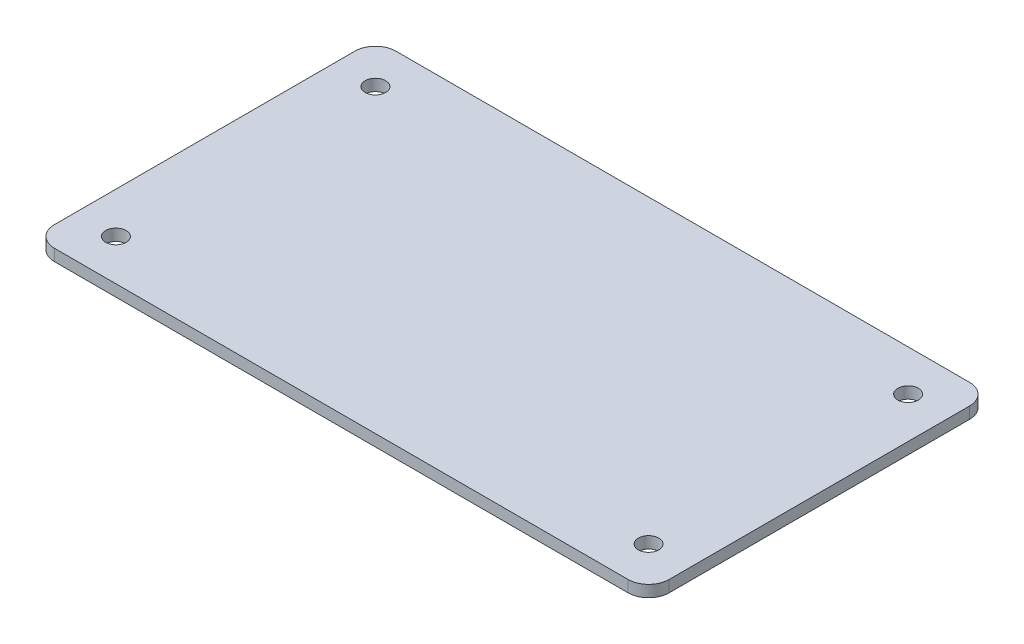
ISO-10303-21;
HEADER;
FILE_DESCRIPTION(('STEP AP214'),'2;1');
FILE_NAME('part.step','',(''),(''),'','','');
FILE_SCHEMA(('AUTOMOTIVE_DESIGN { 1 0 10303 214 1 1 1 1 }'));
ENDSEC;
DATA;
#1=APPLICATION_CONTEXT('core data for automotive mechanical design processes');
#2=APPLICATION_PROTOCOL_DEFINITION('international standard','automotive_design',2000,#1);
#3=PRODUCT_CONTEXT('',#1,'mechanical');
#4=PRODUCT('Part','Part','',(#3));
#5=PRODUCT_RELATED_PRODUCT_CATEGORY('part','',(#4));
#6=PRODUCT_DEFINITION_FORMATION('','',#4);
#7=PRODUCT_DEFINITION_CONTEXT('part definition',#1,'design');
#8=PRODUCT_DEFINITION('design','',#6,#7);
#9=PRODUCT_DEFINITION_SHAPE('','',#8);
#10=(LENGTH_UNIT() NAMED_UNIT(*) SI_UNIT(.MILLI.,.METRE.));
#11=(NAMED_UNIT(*) PLANE_ANGLE_UNIT() SI_UNIT($,.RADIAN.));
#12=(NAMED_UNIT(*) SI_UNIT($,.STERADIAN.) SOLID_ANGLE_UNIT());
#13=UNCERTAINTY_MEASURE_WITH_UNIT(LENGTH_MEASURE(1.E-05),#10,'distance_accuracy_value','');
#14=(GEOMETRIC_REPRESENTATION_CONTEXT(3) GLOBAL_UNCERTAINTY_ASSIGNED_CONTEXT((#13)) GLOBAL_UNIT_ASSIGNED_CONTEXT((#10,
#11,#12)) REPRESENTATION_CONTEXT('',''));
#15=CARTESIAN_POINT('',(0.,0.,0.));
#16=DIRECTION('',(0.,0.,1.));
#17=DIRECTION('',(1.,0.,0.));
#18=AXIS2_PLACEMENT_3D('',#15,#16,#17);
#19=CARTESIAN_POINT('',(-42.,1.7,22.));
#20=DIRECTION('',(0.,-1.,0.));
#21=DIRECTION('',(0.,0.,-1.));
#22=AXIS2_PLACEMENT_3D('',#19,#20,#21);
#23=PLANE('',#22);
#24=CARTESIAN_POINT('',(-42.,1.7,22.));
#25=DIRECTION('',(0.,1.,0.));
#26=DIRECTION('',(0.,0.,-1.));
#27=AXIS2_PLACEMENT_3D('',#24,#25,#26);
#28=CIRCLE('',#27,3.);
#29=CARTESIAN_POINT('',(-45.,1.7,22.));
#30=VERTEX_POINT('',#29);
#31=CARTESIAN_POINT('',(-42.,1.7,25.));
#32=VERTEX_POINT('',#31);
#33=EDGE_CURVE('E150',#30,#32,#28,.T.);
#34=ORIENTED_EDGE('',*,*,#33,.T.);
#35=DIRECTION('',(1.,0.,0.));
#36=VECTOR('',#35,1.);
#37=CARTESIAN_POINT('',(-42.,1.7,25.));
#38=LINE('',#37,#36);
#39=CARTESIAN_POINT('',(42.,1.7,25.));
#40=VERTEX_POINT('',#39);
#41=EDGE_CURVE('E98',#32,#40,#38,.T.);
#42=ORIENTED_EDGE('',*,*,#41,.T.);
#43=CARTESIAN_POINT('',(42.,1.7,22.));
#44=DIRECTION('',(0.,1.,0.));
#45=DIRECTION('',(0.,0.,-1.));
#46=AXIS2_PLACEMENT_3D('',#43,#44,#45);
#47=CIRCLE('',#46,3.);
#48=CARTESIAN_POINT('',(45.,1.7,22.));
#49=VERTEX_POINT('',#48);
#50=EDGE_CURVE('E165',#40,#49,#47,.T.);
#51=ORIENTED_EDGE('',*,*,#50,.T.);
#52=DIRECTION('',(0.,0.,-1.));
#53=VECTOR('',#52,1.);
#54=CARTESIAN_POINT('',(45.,1.7,22.));
#55=LINE('',#54,#53);
#56=CARTESIAN_POINT('',(45.,1.7,-22.));
#57=VERTEX_POINT('',#56);
#58=EDGE_CURVE('E178',#49,#57,#55,.T.);
#59=ORIENTED_EDGE('',*,*,#58,.T.);
#60=CARTESIAN_POINT('',(42.,1.7,-22.));
#61=DIRECTION('',(0.,1.,0.));
#62=DIRECTION('',(0.,0.,1.));
#63=AXIS2_PLACEMENT_3D('',#60,#61,#62);
#64=CIRCLE('',#63,3.);
#65=CARTESIAN_POINT('',(42.,1.7,-25.));
#66=VERTEX_POINT('',#65);
#67=EDGE_CURVE('E117',#57,#66,#64,.T.);
#68=ORIENTED_EDGE('',*,*,#67,.T.);
#69=DIRECTION('',(-1.,0.,0.));
#70=VECTOR('',#69,1.);
#71=CARTESIAN_POINT('',(-42.,1.7,-25.));
#72=LINE('',#71,#70);
#73=CARTESIAN_POINT('',(-42.,1.7,-25.));
#74=VERTEX_POINT('',#73);
#75=EDGE_CURVE('E111',#66,#74,#72,.T.);
#76=ORIENTED_EDGE('',*,*,#75,.T.);
#77=CARTESIAN_POINT('',(-42.,1.7,-22.));
#78=DIRECTION('',(0.,1.,0.));
#79=DIRECTION('',(0.,0.,-1.));
#80=AXIS2_PLACEMENT_3D('',#77,#78,#79);
#81=CIRCLE('',#80,3.);
#82=CARTESIAN_POINT('',(-45.,1.7,-22.));
#83=VERTEX_POINT('',#82);
#84=EDGE_CURVE('E115',#74,#83,#81,.T.);
#85=ORIENTED_EDGE('',*,*,#84,.T.);
#86=DIRECTION('',(0.,0.,1.));
#87=VECTOR('',#86,1.);
#88=CARTESIAN_POINT('',(-45.,1.7,22.));
#89=LINE('',#88,#87);
#90=EDGE_CURVE('E55',#83,#30,#89,.T.);
#91=ORIENTED_EDGE('',*,*,#90,.T.);
#92=EDGE_LOOP('',(#34,#42,#51,#59,#68,#76,#85,#91));
#93=FACE_BOUND('',#92,.T.);
#94=CARTESIAN_POINT('',(-39.,1.7,-19.));
#95=DIRECTION('',(0.,1.,0.));
#96=DIRECTION('',(0.,0.,1.));
#97=AXIS2_PLACEMENT_3D('',#94,#95,#96);
#98=CIRCLE('',#97,1.5);
#99=CARTESIAN_POINT('',(-39.,1.7,-17.5));
#100=VERTEX_POINT('',#99);
#101=EDGE_CURVE('E139',#100,#100,#98,.T.);
#102=ORIENTED_EDGE('',*,*,#101,.F.);
#103=EDGE_LOOP('',(#102));
#104=FACE_BOUND('',#103,.T.);
#105=CARTESIAN_POINT('',(39.,1.7,-19.));
#106=DIRECTION('',(0.,1.,0.));
#107=DIRECTION('',(0.,0.,1.));
#108=AXIS2_PLACEMENT_3D('',#105,#106,#107);
#109=CIRCLE('',#108,1.5);
#110=CARTESIAN_POINT('',(39.,1.7,-17.5));
#111=VERTEX_POINT('',#110);
#112=EDGE_CURVE('E187',#111,#111,#109,.T.);
#113=ORIENTED_EDGE('',*,*,#112,.F.);
#114=EDGE_LOOP('',(#113));
#115=FACE_BOUND('',#114,.T.);
#116=CARTESIAN_POINT('',(-39.,1.7,19.));
#117=DIRECTION('',(0.,1.,0.));
#118=DIRECTION('',(0.,0.,1.));
#119=AXIS2_PLACEMENT_3D('',#116,#117,#118);
#120=CIRCLE('',#119,1.5);
#121=CARTESIAN_POINT('',(-39.,1.7,20.5));
#122=VERTEX_POINT('',#121);
#123=EDGE_CURVE('E193',#122,#122,#120,.T.);
#124=ORIENTED_EDGE('',*,*,#123,.F.);
#125=EDGE_LOOP('',(#124));
#126=FACE_BOUND('',#125,.T.);
#127=CARTESIAN_POINT('',(39.,1.7,19.));
#128=DIRECTION('',(0.,1.,0.));
#129=DIRECTION('',(0.,0.,1.));
#130=AXIS2_PLACEMENT_3D('',#127,#128,#129);
#131=CIRCLE('',#130,1.5);
#132=CARTESIAN_POINT('',(39.,1.7,20.5));
#133=VERTEX_POINT('',#132);
#134=EDGE_CURVE('E199',#133,#133,#131,.T.);
#135=ORIENTED_EDGE('',*,*,#134,.F.);
#136=EDGE_LOOP('',(#135));
#137=FACE_BOUND('',#136,.T.);
#138=ADVANCED_FACE('F38',(#93,#104,#115,#126,#137),#23,.F.);
#139=CARTESIAN_POINT('',(-42.,0.,22.));
#140=DIRECTION('',(0.,-1.,0.));
#141=DIRECTION('',(0.,0.,-1.));
#142=AXIS2_PLACEMENT_3D('',#139,#140,#141);
#143=PLANE('',#142);
#144=CARTESIAN_POINT('',(-39.,0.,19.));
#145=DIRECTION('',(0.,1.,0.));
#146=DIRECTION('',(0.,0.,1.));
#147=AXIS2_PLACEMENT_3D('',#144,#145,#146);
#148=CIRCLE('',#147,1.5);
#149=CARTESIAN_POINT('',(-39.,0.,20.5));
#150=VERTEX_POINT('',#149);
#151=EDGE_CURVE('E196',#150,#150,#148,.T.);
#152=ORIENTED_EDGE('',*,*,#151,.T.);
#153=EDGE_LOOP('',(#152));
#154=FACE_BOUND('',#153,.T.);
#155=CARTESIAN_POINT('',(-39.,0.,-19.));
#156=DIRECTION('',(0.,1.,0.));
#157=DIRECTION('',(0.,0.,1.));
#158=AXIS2_PLACEMENT_3D('',#155,#156,#157);
#159=CIRCLE('',#158,1.5);
#160=CARTESIAN_POINT('',(-39.,0.,-17.5));
#161=VERTEX_POINT('',#160);
#162=EDGE_CURVE('E184',#161,#161,#159,.T.);
#163=ORIENTED_EDGE('',*,*,#162,.T.);
#164=EDGE_LOOP('',(#163));
#165=FACE_BOUND('',#164,.T.);
#166=CARTESIAN_POINT('',(-42.,0.,22.));
#167=DIRECTION('',(0.,1.,0.));
#168=DIRECTION('',(0.,0.,-1.));
#169=AXIS2_PLACEMENT_3D('',#166,#167,#168);
#170=CIRCLE('',#169,3.);
#171=CARTESIAN_POINT('',(-45.,0.,22.));
#172=VERTEX_POINT('',#171);
#173=CARTESIAN_POINT('',(-42.,0.,25.));
#174=VERTEX_POINT('',#173);
#175=EDGE_CURVE('E135',#172,#174,#170,.T.);
#176=ORIENTED_EDGE('',*,*,#175,.F.);
#177=DIRECTION('',(0.,0.,1.));
#178=VECTOR('',#177,1.);
#179=CARTESIAN_POINT('',(-45.,0.,22.));
#180=LINE('',#179,#178);
#181=CARTESIAN_POINT('',(-45.,0.,-22.));
#182=VERTEX_POINT('',#181);
#183=EDGE_CURVE('E90',#182,#172,#180,.T.);
#184=ORIENTED_EDGE('',*,*,#183,.F.);
#185=CARTESIAN_POINT('',(-42.,0.,-22.));
#186=DIRECTION('',(0.,1.,0.));
#187=DIRECTION('',(0.,0.,-1.));
#188=AXIS2_PLACEMENT_3D('',#185,#186,#187);
#189=CIRCLE('',#188,3.);
#190=CARTESIAN_POINT('',(-42.,0.,-25.));
#191=VERTEX_POINT('',#190);
#192=EDGE_CURVE('E84',#191,#182,#189,.T.);
#193=ORIENTED_EDGE('',*,*,#192,.F.);
#194=DIRECTION('',(-1.,0.,0.));
#195=VECTOR('',#194,1.);
#196=CARTESIAN_POINT('',(-42.,0.,-25.));
#197=LINE('',#196,#195);
#198=CARTESIAN_POINT('',(42.,0.,-25.));
#199=VERTEX_POINT('',#198);
#200=EDGE_CURVE('E125',#199,#191,#197,.T.);
#201=ORIENTED_EDGE('',*,*,#200,.F.);
#202=CARTESIAN_POINT('',(42.,0.,-22.));
#203=DIRECTION('',(0.,1.,0.));
#204=DIRECTION('',(0.,0.,1.));
#205=AXIS2_PLACEMENT_3D('',#202,#203,#204);
#206=CIRCLE('',#205,3.);
#207=CARTESIAN_POINT('',(45.,0.,-22.));
#208=VERTEX_POINT('',#207);
#209=EDGE_CURVE('E145',#208,#199,#206,.T.);
#210=ORIENTED_EDGE('',*,*,#209,.F.);
#211=DIRECTION('',(0.,0.,-1.));
#212=VECTOR('',#211,1.);
#213=CARTESIAN_POINT('',(45.,0.,22.));
#214=LINE('',#213,#212);
#215=CARTESIAN_POINT('',(45.,0.,22.));
#216=VERTEX_POINT('',#215);
#217=EDGE_CURVE('E143',#216,#208,#214,.T.);
#218=ORIENTED_EDGE('',*,*,#217,.F.);
#219=CARTESIAN_POINT('',(42.,0.,22.));
#220=DIRECTION('',(0.,1.,0.));
#221=DIRECTION('',(0.,0.,-1.));
#222=AXIS2_PLACEMENT_3D('',#219,#220,#221);
#223=CIRCLE('',#222,3.);
#224=CARTESIAN_POINT('',(42.,0.,25.));
#225=VERTEX_POINT('',#224);
#226=EDGE_CURVE('E141',#225,#216,#223,.T.);
#227=ORIENTED_EDGE('',*,*,#226,.F.);
#228=DIRECTION('',(1.,0.,0.));
#229=VECTOR('',#228,1.);
#230=CARTESIAN_POINT('',(-42.,0.,25.));
#231=LINE('',#230,#229);
#232=EDGE_CURVE('E138',#174,#225,#231,.T.);
#233=ORIENTED_EDGE('',*,*,#232,.F.);
#234=EDGE_LOOP('',(#176,#184,#193,#201,#210,#218,#227,#233));
#235=FACE_BOUND('',#234,.T.);
#236=CARTESIAN_POINT('',(39.,0.,-19.));
#237=DIRECTION('',(0.,1.,0.));
#238=DIRECTION('',(0.,0.,1.));
#239=AXIS2_PLACEMENT_3D('',#236,#237,#238);
#240=CIRCLE('',#239,1.5);
#241=CARTESIAN_POINT('',(39.,0.,-17.5));
#242=VERTEX_POINT('',#241);
#243=EDGE_CURVE('E190',#242,#242,#240,.T.);
#244=ORIENTED_EDGE('',*,*,#243,.T.);
#245=EDGE_LOOP('',(#244));
#246=FACE_BOUND('',#245,.T.);
#247=CARTESIAN_POINT('',(39.,0.,19.));
#248=DIRECTION('',(0.,1.,0.));
#249=DIRECTION('',(0.,0.,1.));
#250=AXIS2_PLACEMENT_3D('',#247,#248,#249);
#251=CIRCLE('',#250,1.5);
#252=CARTESIAN_POINT('',(39.,0.,20.5));
#253=VERTEX_POINT('',#252);
#254=EDGE_CURVE('E202',#253,#253,#251,.T.);
#255=ORIENTED_EDGE('',*,*,#254,.T.);
#256=EDGE_LOOP('',(#255));
#257=FACE_BOUND('',#256,.T.);
#258=ADVANCED_FACE('F169',(#154,#165,#235,#246,#257),#143,.T.);
#259=CARTESIAN_POINT('',(-42.,1.7,22.));
#260=DIRECTION('',(0.,-1.,0.));
#261=DIRECTION('',(0.,0.,-1.));
#262=AXIS2_PLACEMENT_3D('',#259,#260,#261);
#263=CYLINDRICAL_SURFACE('',#262,3.);
#264=ORIENTED_EDGE('',*,*,#175,.T.);
#265=DIRECTION('',(0.,-1.,0.));
#266=VECTOR('',#265,1.);
#267=CARTESIAN_POINT('',(-42.,1.7,25.));
#268=LINE('',#267,#266);
#269=EDGE_CURVE('E11',#32,#174,#268,.T.);
#270=ORIENTED_EDGE('',*,*,#269,.F.);
#271=ORIENTED_EDGE('',*,*,#33,.F.);
#272=DIRECTION('',(0.,-1.,0.));
#273=VECTOR('',#272,1.);
#274=CARTESIAN_POINT('',(-45.,1.7,22.));
#275=LINE('',#274,#273);
#276=EDGE_CURVE('E131',#30,#172,#275,.T.);
#277=ORIENTED_EDGE('',*,*,#276,.T.);
#278=EDGE_LOOP('',(#264,#270,#271,#277));
#279=FACE_BOUND('',#278,.T.);
#280=ADVANCED_FACE('F40',(#279),#263,.T.);
#281=CARTESIAN_POINT('',(-42.,1.7,25.));
#282=DIRECTION('',(0.,0.,-1.));
#283=DIRECTION('',(-1.,0.,0.));
#284=AXIS2_PLACEMENT_3D('',#281,#282,#283);
#285=PLANE('',#284);
#286=ORIENTED_EDGE('',*,*,#232,.T.);
#287=DIRECTION('',(0.,-1.,0.));
#288=VECTOR('',#287,1.);
#289=CARTESIAN_POINT('',(42.,1.7,25.));
#290=LINE('',#289,#288);
#291=EDGE_CURVE('E47',#40,#225,#290,.T.);
#292=ORIENTED_EDGE('',*,*,#291,.F.);
#293=ORIENTED_EDGE('',*,*,#41,.F.);
#294=ORIENTED_EDGE('',*,*,#269,.T.);
#295=EDGE_LOOP('',(#286,#292,#293,#294));
#296=FACE_BOUND('',#295,.T.);
#297=ADVANCED_FACE('F234',(#296),#285,.F.);
#298=CARTESIAN_POINT('',(42.,1.7,22.));
#299=DIRECTION('',(0.,-1.,0.));
#300=DIRECTION('',(0.,0.,-1.));
#301=AXIS2_PLACEMENT_3D('',#298,#299,#300);
#302=CYLINDRICAL_SURFACE('',#301,3.);
#303=ORIENTED_EDGE('',*,*,#226,.T.);
#304=DIRECTION('',(0.,-1.,0.));
#305=VECTOR('',#304,1.);
#306=CARTESIAN_POINT('',(45.,1.7,22.));
#307=LINE('',#306,#305);
#308=EDGE_CURVE('E157',#49,#216,#307,.T.);
#309=ORIENTED_EDGE('',*,*,#308,.F.);
#310=ORIENTED_EDGE('',*,*,#50,.F.);
#311=ORIENTED_EDGE('',*,*,#291,.T.);
#312=EDGE_LOOP('',(#303,#309,#310,#311));
#313=FACE_BOUND('',#312,.T.);
#314=ADVANCED_FACE('F163',(#313),#302,.T.);
#315=CARTESIAN_POINT('',(45.,1.7,22.));
#316=DIRECTION('',(-1.,0.,0.));
#317=DIRECTION('',(0.,0.,1.));
#318=AXIS2_PLACEMENT_3D('',#315,#316,#317);
#319=PLANE('',#318);
#320=ORIENTED_EDGE('',*,*,#217,.T.);
#321=DIRECTION('',(0.,-1.,0.));
#322=VECTOR('',#321,1.);
#323=CARTESIAN_POINT('',(45.,1.7,-22.));
#324=LINE('',#323,#322);
#325=EDGE_CURVE('E154',#57,#208,#324,.T.);
#326=ORIENTED_EDGE('',*,*,#325,.F.);
#327=ORIENTED_EDGE('',*,*,#58,.F.);
#328=ORIENTED_EDGE('',*,*,#308,.T.);
#329=EDGE_LOOP('',(#320,#326,#327,#328));
#330=FACE_BOUND('',#329,.T.);
#331=ADVANCED_FACE('F174',(#330),#319,.F.);
#332=CARTESIAN_POINT('',(42.,1.7,-22.));
#333=DIRECTION('',(0.,-1.,0.));
#334=DIRECTION('',(0.,0.,-1.));
#335=AXIS2_PLACEMENT_3D('',#332,#333,#334);
#336=CYLINDRICAL_SURFACE('',#335,3.);
#337=ORIENTED_EDGE('',*,*,#209,.T.);
#338=DIRECTION('',(0.,-1.,0.));
#339=VECTOR('',#338,1.);
#340=CARTESIAN_POINT('',(42.,1.7,-25.));
#341=LINE('',#340,#339);
#342=EDGE_CURVE('E126',#66,#199,#341,.T.);
#343=ORIENTED_EDGE('',*,*,#342,.F.);
#344=ORIENTED_EDGE('',*,*,#67,.F.);
#345=ORIENTED_EDGE('',*,*,#325,.T.);
#346=EDGE_LOOP('',(#337,#343,#344,#345));
#347=FACE_BOUND('',#346,.T.);
#348=ADVANCED_FACE('F177',(#347),#336,.T.);
#349=CARTESIAN_POINT('',(-42.,1.7,-25.));
#350=DIRECTION('',(0.,0.,1.));
#351=DIRECTION('',(1.,0.,0.));
#352=AXIS2_PLACEMENT_3D('',#349,#350,#351);
#353=PLANE('',#352);
#354=ORIENTED_EDGE('',*,*,#200,.T.);
#355=DIRECTION('',(0.,-1.,0.));
#356=VECTOR('',#355,1.);
#357=CARTESIAN_POINT('',(-42.,1.7,-25.));
#358=LINE('',#357,#356);
#359=EDGE_CURVE('E122',#74,#191,#358,.T.);
#360=ORIENTED_EDGE('',*,*,#359,.F.);
#361=ORIENTED_EDGE('',*,*,#75,.F.);
#362=ORIENTED_EDGE('',*,*,#342,.T.);
#363=EDGE_LOOP('',(#354,#360,#361,#362));
#364=FACE_BOUND('',#363,.T.);
#365=ADVANCED_FACE('F123',(#364),#353,.F.);
#366=CARTESIAN_POINT('',(-42.,1.7,-22.));
#367=DIRECTION('',(0.,-1.,0.));
#368=DIRECTION('',(0.,0.,-1.));
#369=AXIS2_PLACEMENT_3D('',#366,#367,#368);
#370=CYLINDRICAL_SURFACE('',#369,3.);
#371=ORIENTED_EDGE('',*,*,#192,.T.);
#372=DIRECTION('',(0.,-1.,0.));
#373=VECTOR('',#372,1.);
#374=CARTESIAN_POINT('',(-45.,1.7,-22.));
#375=LINE('',#374,#373);
#376=EDGE_CURVE('E127',#83,#182,#375,.T.);
#377=ORIENTED_EDGE('',*,*,#376,.F.);
#378=ORIENTED_EDGE('',*,*,#84,.F.);
#379=ORIENTED_EDGE('',*,*,#359,.T.);
#380=EDGE_LOOP('',(#371,#377,#378,#379));
#381=FACE_BOUND('',#380,.T.);
#382=ADVANCED_FACE('F129',(#381),#370,.T.);
#383=CARTESIAN_POINT('',(-45.,1.7,22.));
#384=DIRECTION('',(1.,0.,0.));
#385=DIRECTION('',(0.,0.,-1.));
#386=AXIS2_PLACEMENT_3D('',#383,#384,#385);
#387=PLANE('',#386);
#388=ORIENTED_EDGE('',*,*,#183,.T.);
#389=ORIENTED_EDGE('',*,*,#276,.F.);
#390=ORIENTED_EDGE('',*,*,#90,.F.);
#391=ORIENTED_EDGE('',*,*,#376,.T.);
#392=EDGE_LOOP('',(#388,#389,#390,#391));
#393=FACE_BOUND('',#392,.T.);
#394=ADVANCED_FACE('F222',(#393),#387,.F.);
#395=CARTESIAN_POINT('',(-39.,1.7,-19.));
#396=DIRECTION('',(0.,-1.,0.));
#397=DIRECTION('',(0.,0.,-1.));
#398=AXIS2_PLACEMENT_3D('',#395,#396,#397);
#399=CYLINDRICAL_SURFACE('',#398,1.5);
#400=ORIENTED_EDGE('',*,*,#101,.T.);
#401=EDGE_LOOP('',(#400));
#402=FACE_BOUND('',#401,.T.);
#403=ORIENTED_EDGE('',*,*,#162,.F.);
#404=EDGE_LOOP('',(#403));
#405=FACE_BOUND('',#404,.T.);
#406=ADVANCED_FACE('F219',(#402,#405),#399,.F.);
#407=CARTESIAN_POINT('',(39.,1.7,-19.));
#408=DIRECTION('',(0.,-1.,0.));
#409=DIRECTION('',(0.,0.,-1.));
#410=AXIS2_PLACEMENT_3D('',#407,#408,#409);
#411=CYLINDRICAL_SURFACE('',#410,1.5);
#412=ORIENTED_EDGE('',*,*,#112,.T.);
#413=EDGE_LOOP('',(#412));
#414=FACE_BOUND('',#413,.T.);
#415=ORIENTED_EDGE('',*,*,#243,.F.);
#416=EDGE_LOOP('',(#415));
#417=FACE_BOUND('',#416,.T.);
#418=ADVANCED_FACE('F310',(#414,#417),#411,.F.);
#419=CARTESIAN_POINT('',(-39.,1.7,19.));
#420=DIRECTION('',(0.,-1.,0.));
#421=DIRECTION('',(0.,0.,-1.));
#422=AXIS2_PLACEMENT_3D('',#419,#420,#421);
#423=CYLINDRICAL_SURFACE('',#422,1.5);
#424=ORIENTED_EDGE('',*,*,#123,.T.);
#425=EDGE_LOOP('',(#424));
#426=FACE_BOUND('',#425,.T.);
#427=ORIENTED_EDGE('',*,*,#151,.F.);
#428=EDGE_LOOP('',(#427));
#429=FACE_BOUND('',#428,.T.);
#430=ADVANCED_FACE('F319',(#426,#429),#423,.F.);
#431=CARTESIAN_POINT('',(39.,1.7,19.));
#432=DIRECTION('',(0.,-1.,0.));
#433=DIRECTION('',(0.,0.,-1.));
#434=AXIS2_PLACEMENT_3D('',#431,#432,#433);
#435=CYLINDRICAL_SURFACE('',#434,1.5);
#436=ORIENTED_EDGE('',*,*,#134,.T.);
#437=EDGE_LOOP('',(#436));
#438=FACE_BOUND('',#437,.T.);
#439=ORIENTED_EDGE('',*,*,#254,.F.);
#440=EDGE_LOOP('',(#439));
#441=FACE_BOUND('',#440,.T.);
#442=ADVANCED_FACE('F208',(#438,#441),#435,.F.);
#443=CLOSED_SHELL('',(#138,#258,#280,#297,#314,#331,#348,#365,#382,#394,#406,#418,#430,#442));
#444=MANIFOLD_SOLID_BREP('B2',#443);
#445=ADVANCED_BREP_SHAPE_REPRESENTATION('',(#18,#444),#14);
#446=SHAPE_DEFINITION_REPRESENTATION(#9,#445);
ENDSEC;
END-ISO-10303-21;
